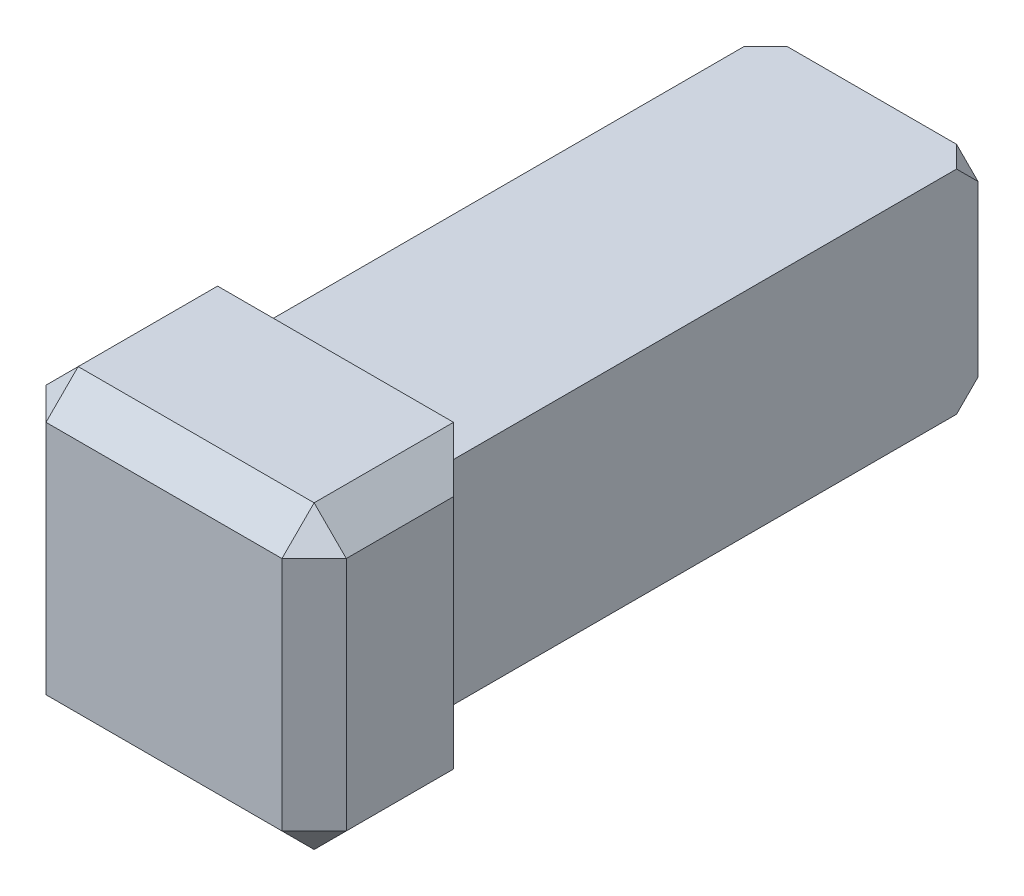
ISO-10303-21;
HEADER;
FILE_DESCRIPTION(('STEP AP214'),'2;1');
FILE_NAME('part.step','',(''),(''),'','','');
FILE_SCHEMA(('AUTOMOTIVE_DESIGN { 1 0 10303 214 1 1 1 1 }'));
ENDSEC;
DATA;
#1=APPLICATION_CONTEXT('core data for automotive mechanical design processes');
#2=APPLICATION_PROTOCOL_DEFINITION('international standard','automotive_design',2000,#1);
#3=PRODUCT_CONTEXT('',#1,'mechanical');
#4=PRODUCT('Part','Part','',(#3));
#5=PRODUCT_RELATED_PRODUCT_CATEGORY('part','',(#4));
#6=PRODUCT_DEFINITION_FORMATION('','',#4);
#7=PRODUCT_DEFINITION_CONTEXT('part definition',#1,'design');
#8=PRODUCT_DEFINITION('design','',#6,#7);
#9=PRODUCT_DEFINITION_SHAPE('','',#8);
#10=(LENGTH_UNIT() NAMED_UNIT(*) SI_UNIT(.MILLI.,.METRE.));
#11=(NAMED_UNIT(*) PLANE_ANGLE_UNIT() SI_UNIT($,.RADIAN.));
#12=(NAMED_UNIT(*) SI_UNIT($,.STERADIAN.) SOLID_ANGLE_UNIT());
#13=UNCERTAINTY_MEASURE_WITH_UNIT(LENGTH_MEASURE(1.E-05),#10,'distance_accuracy_value','');
#14=(GEOMETRIC_REPRESENTATION_CONTEXT(3) GLOBAL_UNCERTAINTY_ASSIGNED_CONTEXT((#13)) GLOBAL_UNIT_ASSIGNED_CONTEXT((#10,
#11,#12)) REPRESENTATION_CONTEXT('',''));
#15=CARTESIAN_POINT('',(0.,0.,0.));
#16=DIRECTION('',(0.,0.,1.));
#17=DIRECTION('',(1.,0.,0.));
#18=AXIS2_PLACEMENT_3D('',#15,#16,#17);
#19=CARTESIAN_POINT('',(4.95,4.95,25.));
#20=DIRECTION('',(-1.,0.,0.));
#21=DIRECTION('',(0.,-1.,0.));
#22=AXIS2_PLACEMENT_3D('',#19,#20,#21);
#23=PLANE('',#22);
#24=DIRECTION('',(0.,-0.707106781186548,0.707106781186547));
#25=VECTOR('',#24,1.);
#26=CARTESIAN_POINT('',(4.95,-12.,8.05));
#27=LINE('',#26,#25);
#28=CARTESIAN_POINT('',(4.95,-3.95,0.));
#29=VERTEX_POINT('',#28);
#30=CARTESIAN_POINT('',(4.95,-4.95,1.));
#31=VERTEX_POINT('',#30);
#32=EDGE_CURVE('E168',#29,#31,#27,.T.);
#33=ORIENTED_EDGE('',*,*,#32,.F.);
#34=DIRECTION('',(0.,1.,0.));
#35=VECTOR('',#34,1.);
#36=CARTESIAN_POINT('',(4.95,4.95,0.));
#37=LINE('',#36,#35);
#38=CARTESIAN_POINT('',(4.95,3.95,0.));
#39=VERTEX_POINT('',#38);
#40=EDGE_CURVE('E157',#29,#39,#37,.T.);
#41=ORIENTED_EDGE('',*,*,#40,.T.);
#42=DIRECTION('',(0.,-0.707106781186548,-0.707106781186547));
#43=VECTOR('',#42,1.);
#44=CARTESIAN_POINT('',(4.95,16.95,13.));
#45=LINE('',#44,#43);
#46=CARTESIAN_POINT('',(4.95,4.95,1.));
#47=VERTEX_POINT('',#46);
#48=EDGE_CURVE('E178',#47,#39,#45,.T.);
#49=ORIENTED_EDGE('',*,*,#48,.F.);
#50=DIRECTION('',(0.,0.,-1.));
#51=VECTOR('',#50,1.);
#52=CARTESIAN_POINT('',(4.95,4.95,25.));
#53=LINE('',#52,#51);
#54=CARTESIAN_POINT('',(4.95,4.95,25.));
#55=VERTEX_POINT('',#54);
#56=EDGE_CURVE('E281',#55,#47,#53,.T.);
#57=ORIENTED_EDGE('',*,*,#56,.F.);
#58=DIRECTION('',(0.,1.,0.));
#59=VECTOR('',#58,1.);
#60=CARTESIAN_POINT('',(4.95,4.95,25.));
#61=LINE('',#60,#59);
#62=CARTESIAN_POINT('',(4.95,-4.95,25.));
#63=VERTEX_POINT('',#62);
#64=EDGE_CURVE('E294',#63,#55,#61,.T.);
#65=ORIENTED_EDGE('',*,*,#64,.F.);
#66=DIRECTION('',(0.,0.,-1.));
#67=VECTOR('',#66,1.);
#68=CARTESIAN_POINT('',(4.95,-4.95,25.));
#69=LINE('',#68,#67);
#70=EDGE_CURVE('E169',#63,#31,#69,.T.);
#71=ORIENTED_EDGE('',*,*,#70,.T.);
#72=EDGE_LOOP('',(#33,#41,#49,#57,#65,#71));
#73=FACE_BOUND('',#72,.T.);
#74=ADVANCED_FACE('F35',(#73),#23,.F.);
#75=CARTESIAN_POINT('',(-4.95,4.95,25.));
#76=DIRECTION('',(0.,-1.,0.));
#77=DIRECTION('',(0.,0.,-1.));
#78=AXIS2_PLACEMENT_3D('',#75,#76,#77);
#79=PLANE('',#78);
#80=DIRECTION('',(0.707106781186548,0.,0.707106781186547));
#81=VECTOR('',#80,1.);
#82=CARTESIAN_POINT('',(12.,4.95,8.05));
#83=LINE('',#82,#81);
#84=CARTESIAN_POINT('',(3.95,4.95,0.));
#85=VERTEX_POINT('',#84);
#86=EDGE_CURVE('E175',#85,#47,#83,.T.);
#87=ORIENTED_EDGE('',*,*,#86,.F.);
#88=DIRECTION('',(-1.,0.,0.));
#89=VECTOR('',#88,1.);
#90=CARTESIAN_POINT('',(-4.95,4.95,0.));
#91=LINE('',#90,#89);
#92=CARTESIAN_POINT('',(-3.95,4.95,0.));
#93=VERTEX_POINT('',#92);
#94=EDGE_CURVE('E164',#85,#93,#91,.T.);
#95=ORIENTED_EDGE('',*,*,#94,.T.);
#96=DIRECTION('',(0.707106781186548,0.,-0.707106781186547));
#97=VECTOR('',#96,1.);
#98=CARTESIAN_POINT('',(-16.95,4.95,13.));
#99=LINE('',#98,#97);
#100=CARTESIAN_POINT('',(-4.95,4.95,0.999999999999997));
#101=VERTEX_POINT('',#100);
#102=EDGE_CURVE('E186',#101,#93,#99,.T.);
#103=ORIENTED_EDGE('',*,*,#102,.F.);
#104=DIRECTION('',(0.,0.,-1.));
#105=VECTOR('',#104,1.);
#106=CARTESIAN_POINT('',(-4.95,4.95,25.));
#107=LINE('',#106,#105);
#108=CARTESIAN_POINT('',(-4.95,4.95,25.));
#109=VERTEX_POINT('',#108);
#110=EDGE_CURVE('E284',#109,#101,#107,.T.);
#111=ORIENTED_EDGE('',*,*,#110,.F.);
#112=DIRECTION('',(-1.,0.,0.));
#113=VECTOR('',#112,1.);
#114=CARTESIAN_POINT('',(-4.95,4.95,25.));
#115=LINE('',#114,#113);
#116=EDGE_CURVE('E303',#55,#109,#115,.T.);
#117=ORIENTED_EDGE('',*,*,#116,.F.);
#118=ORIENTED_EDGE('',*,*,#56,.T.);
#119=EDGE_LOOP('',(#87,#95,#103,#111,#117,#118));
#120=FACE_BOUND('',#119,.T.);
#121=ADVANCED_FACE('F394',(#120),#79,.F.);
#122=CARTESIAN_POINT('',(-4.95,4.95,25.));
#123=DIRECTION('',(1.,0.,0.));
#124=DIRECTION('',(0.,1.,0.));
#125=AXIS2_PLACEMENT_3D('',#122,#123,#124);
#126=PLANE('',#125);
#127=DIRECTION('',(0.,0.707106781186548,0.707106781186547));
#128=VECTOR('',#127,1.);
#129=CARTESIAN_POINT('',(-4.95,16.95,13.));
#130=LINE('',#129,#128);
#131=CARTESIAN_POINT('',(-4.95,3.95,0.));
#132=VERTEX_POINT('',#131);
#133=EDGE_CURVE('E183',#132,#101,#130,.T.);
#134=ORIENTED_EDGE('',*,*,#133,.F.);
#135=DIRECTION('',(0.,-1.,0.));
#136=VECTOR('',#135,1.);
#137=CARTESIAN_POINT('',(-4.95,4.95,0.));
#138=LINE('',#137,#136);
#139=CARTESIAN_POINT('',(-4.95,-3.95,0.));
#140=VERTEX_POINT('',#139);
#141=EDGE_CURVE('E295',#132,#140,#138,.T.);
#142=ORIENTED_EDGE('',*,*,#141,.T.);
#143=DIRECTION('',(0.,0.707106781186548,-0.707106781186547));
#144=VECTOR('',#143,1.);
#145=CARTESIAN_POINT('',(-4.95,-12.,8.05));
#146=LINE('',#145,#144);
#147=CARTESIAN_POINT('',(-4.95,-4.95,0.999999999999999));
#148=VERTEX_POINT('',#147);
#149=EDGE_CURVE('E195',#148,#140,#146,.T.);
#150=ORIENTED_EDGE('',*,*,#149,.F.);
#151=DIRECTION('',(0.,0.,-1.));
#152=VECTOR('',#151,1.);
#153=CARTESIAN_POINT('',(-4.95,-4.95,25.));
#154=LINE('',#153,#152);
#155=CARTESIAN_POINT('',(-4.95,-4.95,25.));
#156=VERTEX_POINT('',#155);
#157=EDGE_CURVE('E287',#156,#148,#154,.T.);
#158=ORIENTED_EDGE('',*,*,#157,.F.);
#159=DIRECTION('',(0.,-1.,0.));
#160=VECTOR('',#159,1.);
#161=CARTESIAN_POINT('',(-4.95,4.95,25.));
#162=LINE('',#161,#160);
#163=EDGE_CURVE('E300',#109,#156,#162,.T.);
#164=ORIENTED_EDGE('',*,*,#163,.F.);
#165=ORIENTED_EDGE('',*,*,#110,.T.);
#166=EDGE_LOOP('',(#134,#142,#150,#158,#164,#165));
#167=FACE_BOUND('',#166,.T.);
#168=ADVANCED_FACE('F399',(#167),#126,.F.);
#169=CARTESIAN_POINT('',(-4.95,-4.95,25.));
#170=DIRECTION('',(0.,1.,0.));
#171=DIRECTION('',(0.,0.,1.));
#172=AXIS2_PLACEMENT_3D('',#169,#170,#171);
#173=PLANE('',#172);
#174=DIRECTION('',(-0.707106781186548,0.,-0.707106781186547));
#175=VECTOR('',#174,1.);
#176=CARTESIAN_POINT('',(12.,-4.95,8.05));
#177=LINE('',#176,#175);
#178=CARTESIAN_POINT('',(3.95,-4.95,0.));
#179=VERTEX_POINT('',#178);
#180=EDGE_CURVE('E44',#31,#179,#177,.T.);
#181=ORIENTED_EDGE('',*,*,#180,.F.);
#182=ORIENTED_EDGE('',*,*,#70,.F.);
#183=DIRECTION('',(1.,0.,0.));
#184=VECTOR('',#183,1.);
#185=CARTESIAN_POINT('',(-4.95,-4.95,25.));
#186=LINE('',#185,#184);
#187=EDGE_CURVE('E291',#156,#63,#186,.T.);
#188=ORIENTED_EDGE('',*,*,#187,.F.);
#189=ORIENTED_EDGE('',*,*,#157,.T.);
#190=DIRECTION('',(-0.707106781186548,0.,0.707106781186547));
#191=VECTOR('',#190,1.);
#192=CARTESIAN_POINT('',(-16.95,-4.95,13.));
#193=LINE('',#192,#191);
#194=CARTESIAN_POINT('',(-3.95,-4.95,0.));
#195=VERTEX_POINT('',#194);
#196=EDGE_CURVE('E192',#195,#148,#193,.T.);
#197=ORIENTED_EDGE('',*,*,#196,.F.);
#198=DIRECTION('',(1.,0.,0.));
#199=VECTOR('',#198,1.);
#200=CARTESIAN_POINT('',(-4.95,-4.95,0.));
#201=LINE('',#200,#199);
#202=EDGE_CURVE('E292',#195,#179,#201,.T.);
#203=ORIENTED_EDGE('',*,*,#202,.T.);
#204=EDGE_LOOP('',(#181,#182,#188,#189,#197,#203));
#205=FACE_BOUND('',#204,.T.);
#206=ADVANCED_FACE('F485',(#205),#173,.F.);
#207=CARTESIAN_POINT('',(0.,0.,0.));
#208=DIRECTION('',(0.,0.,1.));
#209=DIRECTION('',(1.,0.,0.));
#210=AXIS2_PLACEMENT_3D('',#207,#208,#209);
#211=PLANE('',#210);
#212=DIRECTION('',(0.707106781186548,0.707106781186548,0.));
#213=VECTOR('',#212,1.);
#214=CARTESIAN_POINT('',(4.45,-4.45,0.));
#215=LINE('',#214,#213);
#216=EDGE_CURVE('E11',#179,#29,#215,.T.);
#217=ORIENTED_EDGE('',*,*,#216,.F.);
#218=ORIENTED_EDGE('',*,*,#202,.F.);
#219=DIRECTION('',(0.707106781186548,-0.707106781186548,0.));
#220=VECTOR('',#219,1.);
#221=CARTESIAN_POINT('',(-4.45,-4.45,0.));
#222=LINE('',#221,#220);
#223=EDGE_CURVE('E189',#140,#195,#222,.T.);
#224=ORIENTED_EDGE('',*,*,#223,.F.);
#225=ORIENTED_EDGE('',*,*,#141,.F.);
#226=DIRECTION('',(-0.707106781186548,-0.707106781186548,0.));
#227=VECTOR('',#226,1.);
#228=CARTESIAN_POINT('',(-4.45,4.45,0.));
#229=LINE('',#228,#227);
#230=EDGE_CURVE('E180',#93,#132,#229,.T.);
#231=ORIENTED_EDGE('',*,*,#230,.F.);
#232=ORIENTED_EDGE('',*,*,#94,.F.);
#233=DIRECTION('',(-0.707106781186548,0.707106781186548,0.));
#234=VECTOR('',#233,1.);
#235=CARTESIAN_POINT('',(4.45,4.45,0.));
#236=LINE('',#235,#234);
#237=EDGE_CURVE('E161',#39,#85,#236,.T.);
#238=ORIENTED_EDGE('',*,*,#237,.F.);
#239=ORIENTED_EDGE('',*,*,#40,.F.);
#240=EDGE_LOOP('',(#217,#218,#224,#225,#231,#232,#238,#239));
#241=FACE_BOUND('',#240,.T.);
#242=ADVANCED_FACE('F159',(#241),#211,.F.);
#243=CARTESIAN_POINT('',(0.,0.,25.));
#244=DIRECTION('',(0.,0.,1.));
#245=DIRECTION('',(1.,0.,0.));
#246=AXIS2_PLACEMENT_3D('',#243,#244,#245);
#247=PLANE('',#246);
#248=DIRECTION('',(-1.,0.,0.));
#249=VECTOR('',#248,1.);
#250=CARTESIAN_POINT('',(-7.,7.,25.));
#251=LINE('',#250,#249);
#252=CARTESIAN_POINT('',(5.5,7.,25.));
#253=VERTEX_POINT('',#252);
#254=CARTESIAN_POINT('',(-5.5,7.,25.));
#255=VERTEX_POINT('',#254);
#256=EDGE_CURVE('E202',#253,#255,#251,.T.);
#257=ORIENTED_EDGE('',*,*,#256,.F.);
#258=DIRECTION('',(0.,-1.,0.));
#259=VECTOR('',#258,1.);
#260=CARTESIAN_POINT('',(5.5,0.,25.));
#261=LINE('',#260,#259);
#262=CARTESIAN_POINT('',(5.5,-7.,25.));
#263=VERTEX_POINT('',#262);
#264=EDGE_CURVE('E259',#253,#263,#261,.T.);
#265=ORIENTED_EDGE('',*,*,#264,.T.);
#266=DIRECTION('',(1.,0.,0.));
#267=VECTOR('',#266,1.);
#268=CARTESIAN_POINT('',(-7.,-7.,25.));
#269=LINE('',#268,#267);
#270=CARTESIAN_POINT('',(-5.5,-7.,25.));
#271=VERTEX_POINT('',#270);
#272=EDGE_CURVE('E165',#271,#263,#269,.T.);
#273=ORIENTED_EDGE('',*,*,#272,.F.);
#274=DIRECTION('',(0.707106781186547,-0.707106781186548,0.));
#275=VECTOR('',#274,1.);
#276=CARTESIAN_POINT('',(-5.5,-7.,25.));
#277=LINE('',#276,#275);
#278=CARTESIAN_POINT('',(-7.,-5.5,25.));
#279=VERTEX_POINT('',#278);
#280=EDGE_CURVE('E263',#271,#279,#277,.F.);
#281=ORIENTED_EDGE('',*,*,#280,.T.);
#282=DIRECTION('',(0.,-1.,0.));
#283=VECTOR('',#282,1.);
#284=CARTESIAN_POINT('',(-7.,7.,25.));
#285=LINE('',#284,#283);
#286=CARTESIAN_POINT('',(-7.,5.49999999999999,25.));
#287=VERTEX_POINT('',#286);
#288=EDGE_CURVE('E310',#287,#279,#285,.T.);
#289=ORIENTED_EDGE('',*,*,#288,.F.);
#290=DIRECTION('',(-0.707106781186547,-0.707106781186548,0.));
#291=VECTOR('',#290,1.);
#292=CARTESIAN_POINT('',(-7.,5.49999999999999,25.));
#293=LINE('',#292,#291);
#294=EDGE_CURVE('E261',#287,#255,#293,.F.);
#295=ORIENTED_EDGE('',*,*,#294,.T.);
#296=EDGE_LOOP('',(#257,#265,#273,#281,#289,#295));
#297=FACE_BOUND('',#296,.T.);
#298=ORIENTED_EDGE('',*,*,#187,.T.);
#299=ORIENTED_EDGE('',*,*,#64,.T.);
#300=ORIENTED_EDGE('',*,*,#116,.T.);
#301=ORIENTED_EDGE('',*,*,#163,.T.);
#302=EDGE_LOOP('',(#298,#299,#300,#301));
#303=FACE_BOUND('',#302,.T.);
#304=ADVANCED_FACE('F349',(#297,#303),#247,.F.);
#305=CARTESIAN_POINT('',(7.,7.,33.));
#306=DIRECTION('',(-1.,0.,0.));
#307=DIRECTION('',(0.,-1.,0.));
#308=AXIS2_PLACEMENT_3D('',#305,#306,#307);
#309=PLANE('',#308);
#310=DIRECTION('',(0.,-1.,0.));
#311=VECTOR('',#310,1.);
#312=CARTESIAN_POINT('',(7.,-7.,31.5));
#313=LINE('',#312,#311);
#314=CARTESIAN_POINT('',(7.,5.49999999999999,31.5));
#315=VERTEX_POINT('',#314);
#316=CARTESIAN_POINT('',(7.,-5.5,31.5));
#317=VERTEX_POINT('',#316);
#318=EDGE_CURVE('E279',#315,#317,#313,.T.);
#319=ORIENTED_EDGE('',*,*,#318,.T.);
#320=DIRECTION('',(0.,0.,-1.));
#321=VECTOR('',#320,1.);
#322=CARTESIAN_POINT('',(7.,-5.5,33.));
#323=LINE('',#322,#321);
#324=CARTESIAN_POINT('',(7.,-5.5,26.5));
#325=VERTEX_POINT('',#324);
#326=EDGE_CURVE('E272',#317,#325,#323,.T.);
#327=ORIENTED_EDGE('',*,*,#326,.T.);
#328=DIRECTION('',(0.,1.,0.));
#329=VECTOR('',#328,1.);
#330=CARTESIAN_POINT('',(7.,7.,26.5));
#331=LINE('',#330,#329);
#332=CARTESIAN_POINT('',(7.,5.49999999999999,26.5));
#333=VERTEX_POINT('',#332);
#334=EDGE_CURVE('E275',#325,#333,#331,.T.);
#335=ORIENTED_EDGE('',*,*,#334,.T.);
#336=DIRECTION('',(0.,0.,1.));
#337=VECTOR('',#336,1.);
#338=CARTESIAN_POINT('',(7.,5.49999999999999,33.));
#339=LINE('',#338,#337);
#340=EDGE_CURVE('E277',#333,#315,#339,.T.);
#341=ORIENTED_EDGE('',*,*,#340,.T.);
#342=EDGE_LOOP('',(#319,#327,#335,#341));
#343=FACE_BOUND('',#342,.T.);
#344=ADVANCED_FACE('F391',(#343),#309,.F.);
#345=CARTESIAN_POINT('',(-7.,7.,33.));
#346=DIRECTION('',(0.,-1.,0.));
#347=DIRECTION('',(0.,0.,-1.));
#348=AXIS2_PLACEMENT_3D('',#345,#346,#347);
#349=PLANE('',#348);
#350=DIRECTION('',(1.,0.,0.));
#351=VECTOR('',#350,1.);
#352=CARTESIAN_POINT('',(7.,7.,31.5));
#353=LINE('',#352,#351);
#354=CARTESIAN_POINT('',(-5.5,7.,31.5));
#355=VERTEX_POINT('',#354);
#356=CARTESIAN_POINT('',(5.5,7.,31.5));
#357=VERTEX_POINT('',#356);
#358=EDGE_CURVE('E255',#355,#357,#353,.T.);
#359=ORIENTED_EDGE('',*,*,#358,.T.);
#360=DIRECTION('',(0.,0.,-1.));
#361=VECTOR('',#360,1.);
#362=CARTESIAN_POINT('',(5.5,7.,33.));
#363=LINE('',#362,#361);
#364=EDGE_CURVE('E253',#357,#253,#363,.T.);
#365=ORIENTED_EDGE('',*,*,#364,.T.);
#366=ORIENTED_EDGE('',*,*,#256,.T.);
#367=DIRECTION('',(0.,0.,1.));
#368=VECTOR('',#367,1.);
#369=CARTESIAN_POINT('',(-5.5,7.,33.));
#370=LINE('',#369,#368);
#371=EDGE_CURVE('E257',#255,#355,#370,.T.);
#372=ORIENTED_EDGE('',*,*,#371,.T.);
#373=EDGE_LOOP('',(#359,#365,#366,#372));
#374=FACE_BOUND('',#373,.T.);
#375=ADVANCED_FACE('F317',(#374),#349,.F.);
#376=CARTESIAN_POINT('',(-7.,7.,33.));
#377=DIRECTION('',(1.,0.,0.));
#378=DIRECTION('',(0.,1.,0.));
#379=AXIS2_PLACEMENT_3D('',#376,#377,#378);
#380=PLANE('',#379);
#381=DIRECTION('',(0.,1.,0.));
#382=VECTOR('',#381,1.);
#383=CARTESIAN_POINT('',(-7.,7.,31.5));
#384=LINE('',#383,#382);
#385=CARTESIAN_POINT('',(-7.,-5.5,31.5));
#386=VERTEX_POINT('',#385);
#387=CARTESIAN_POINT('',(-7.,5.49999999999999,31.5));
#388=VERTEX_POINT('',#387);
#389=EDGE_CURVE('E240',#386,#388,#384,.T.);
#390=ORIENTED_EDGE('',*,*,#389,.T.);
#391=DIRECTION('',(0.,0.,-1.));
#392=VECTOR('',#391,1.);
#393=CARTESIAN_POINT('',(-7.,5.49999999999999,33.));
#394=LINE('',#393,#392);
#395=EDGE_CURVE('E198',#388,#287,#394,.T.);
#396=ORIENTED_EDGE('',*,*,#395,.T.);
#397=ORIENTED_EDGE('',*,*,#288,.T.);
#398=DIRECTION('',(0.,0.,1.));
#399=VECTOR('',#398,1.);
#400=CARTESIAN_POINT('',(-7.,-5.5,33.));
#401=LINE('',#400,#399);
#402=EDGE_CURVE('E242',#279,#386,#401,.T.);
#403=ORIENTED_EDGE('',*,*,#402,.T.);
#404=EDGE_LOOP('',(#390,#396,#397,#403));
#405=FACE_BOUND('',#404,.T.);
#406=ADVANCED_FACE('F381',(#405),#380,.F.);
#407=CARTESIAN_POINT('',(-7.,-7.,33.));
#408=DIRECTION('',(0.,1.,0.));
#409=DIRECTION('',(0.,0.,1.));
#410=AXIS2_PLACEMENT_3D('',#407,#408,#409);
#411=PLANE('',#410);
#412=ORIENTED_EDGE('',*,*,#272,.T.);
#413=DIRECTION('',(0.,0.,1.));
#414=VECTOR('',#413,1.);
#415=CARTESIAN_POINT('',(5.5,-7.,33.));
#416=LINE('',#415,#414);
#417=CARTESIAN_POINT('',(5.5,-7.,31.5));
#418=VERTEX_POINT('',#417);
#419=EDGE_CURVE('E265',#263,#418,#416,.T.);
#420=ORIENTED_EDGE('',*,*,#419,.T.);
#421=DIRECTION('',(-1.,0.,0.));
#422=VECTOR('',#421,1.);
#423=CARTESIAN_POINT('',(-7.,-7.,31.5));
#424=LINE('',#423,#422);
#425=CARTESIAN_POINT('',(-5.5,-7.,31.5));
#426=VERTEX_POINT('',#425);
#427=EDGE_CURVE('E268',#418,#426,#424,.T.);
#428=ORIENTED_EDGE('',*,*,#427,.T.);
#429=DIRECTION('',(0.,0.,-1.));
#430=VECTOR('',#429,1.);
#431=CARTESIAN_POINT('',(-5.5,-7.,33.));
#432=LINE('',#431,#430);
#433=EDGE_CURVE('E270',#426,#271,#432,.T.);
#434=ORIENTED_EDGE('',*,*,#433,.T.);
#435=EDGE_LOOP('',(#412,#420,#428,#434));
#436=FACE_BOUND('',#435,.T.);
#437=ADVANCED_FACE('F354',(#436),#411,.F.);
#438=CARTESIAN_POINT('',(0.,0.,33.));
#439=DIRECTION('',(0.,0.,1.));
#440=DIRECTION('',(1.,0.,0.));
#441=AXIS2_PLACEMENT_3D('',#438,#439,#440);
#442=PLANE('',#441);
#443=DIRECTION('',(0.,-1.,0.));
#444=VECTOR('',#443,1.);
#445=CARTESIAN_POINT('',(-5.5,-7.,33.));
#446=LINE('',#445,#444);
#447=CARTESIAN_POINT('',(-5.5,5.5,33.));
#448=VERTEX_POINT('',#447);
#449=CARTESIAN_POINT('',(-5.5,-5.5,33.));
#450=VERTEX_POINT('',#449);
#451=EDGE_CURVE('E251',#448,#450,#446,.T.);
#452=ORIENTED_EDGE('',*,*,#451,.T.);
#453=DIRECTION('',(1.,0.,0.));
#454=VECTOR('',#453,1.);
#455=CARTESIAN_POINT('',(7.,-5.5,33.));
#456=LINE('',#455,#454);
#457=CARTESIAN_POINT('',(5.5,-5.5,33.));
#458=VERTEX_POINT('',#457);
#459=EDGE_CURVE('E244',#450,#458,#456,.T.);
#460=ORIENTED_EDGE('',*,*,#459,.T.);
#461=DIRECTION('',(0.,1.,0.));
#462=VECTOR('',#461,1.);
#463=CARTESIAN_POINT('',(5.5,7.,33.));
#464=LINE('',#463,#462);
#465=CARTESIAN_POINT('',(5.5,5.5,33.));
#466=VERTEX_POINT('',#465);
#467=EDGE_CURVE('E247',#458,#466,#464,.T.);
#468=ORIENTED_EDGE('',*,*,#467,.T.);
#469=DIRECTION('',(-1.,0.,0.));
#470=VECTOR('',#469,1.);
#471=CARTESIAN_POINT('',(-7.,5.5,33.));
#472=LINE('',#471,#470);
#473=EDGE_CURVE('E249',#466,#448,#472,.T.);
#474=ORIENTED_EDGE('',*,*,#473,.T.);
#475=EDGE_LOOP('',(#452,#460,#468,#474));
#476=FACE_BOUND('',#475,.T.);
#477=ADVANCED_FACE('F389',(#476),#442,.T.);
#478=CARTESIAN_POINT('',(-7.,5.49999999999999,33.));
#479=DIRECTION('',(0.707106781186548,-0.707106781186547,0.));
#480=DIRECTION('',(0.,0.,-1.));
#481=AXIS2_PLACEMENT_3D('',#478,#479,#480);
#482=PLANE('',#481);
#483=DIRECTION('',(0.707106781186547,0.707106781186548,0.));
#484=VECTOR('',#483,1.);
#485=CARTESIAN_POINT('',(-6.25,6.25,31.5));
#486=LINE('',#485,#484);
#487=EDGE_CURVE('E199',#355,#388,#486,.F.);
#488=ORIENTED_EDGE('',*,*,#487,.F.);
#489=ORIENTED_EDGE('',*,*,#371,.F.);
#490=ORIENTED_EDGE('',*,*,#294,.F.);
#491=ORIENTED_EDGE('',*,*,#395,.F.);
#492=EDGE_LOOP('',(#488,#489,#490,#491));
#493=FACE_BOUND('',#492,.T.);
#494=ADVANCED_FACE('F38',(#493),#482,.F.);
#495=CARTESIAN_POINT('',(-5.5,5.5,33.));
#496=DIRECTION('',(-0.577350269189627,0.577350269189625,0.577350269189625));
#497=DIRECTION('',(0.707106781186547,0.,0.707106781186548));
#498=AXIS2_PLACEMENT_3D('',#495,#496,#497);
#499=PLANE('',#498);
#500=DIRECTION('',(0.,0.707106781186547,-0.707106781186547));
#501=VECTOR('',#500,1.);
#502=CARTESIAN_POINT('',(-5.5,5.5,33.));
#503=LINE('',#502,#501);
#504=EDGE_CURVE('E206',#355,#448,#503,.F.);
#505=ORIENTED_EDGE('',*,*,#504,.F.);
#506=ORIENTED_EDGE('',*,*,#487,.T.);
#507=DIRECTION('',(0.707106781186548,0.,0.707106781186548));
#508=VECTOR('',#507,1.);
#509=CARTESIAN_POINT('',(-5.5,5.5,33.));
#510=LINE('',#509,#508);
#511=EDGE_CURVE('E203',#448,#388,#510,.F.);
#512=ORIENTED_EDGE('',*,*,#511,.F.);
#513=EDGE_LOOP('',(#505,#506,#512));
#514=FACE_BOUND('',#513,.T.);
#515=ADVANCED_FACE('F329',(#514),#499,.T.);
#516=CARTESIAN_POINT('',(-5.5,-7.,33.));
#517=DIRECTION('',(0.707106781186548,0.707106781186547,0.));
#518=DIRECTION('',(0.,0.,-1.));
#519=AXIS2_PLACEMENT_3D('',#516,#517,#518);
#520=PLANE('',#519);
#521=ORIENTED_EDGE('',*,*,#280,.F.);
#522=ORIENTED_EDGE('',*,*,#433,.F.);
#523=DIRECTION('',(-0.707106781186547,0.707106781186548,0.));
#524=VECTOR('',#523,1.);
#525=CARTESIAN_POINT('',(-5.5,-7.,31.5));
#526=LINE('',#525,#524);
#527=EDGE_CURVE('E209',#386,#426,#526,.F.);
#528=ORIENTED_EDGE('',*,*,#527,.F.);
#529=ORIENTED_EDGE('',*,*,#402,.F.);
#530=EDGE_LOOP('',(#521,#522,#528,#529));
#531=FACE_BOUND('',#530,.T.);
#532=ADVANCED_FACE('F372',(#531),#520,.F.);
#533=CARTESIAN_POINT('',(-5.5,0.,33.));
#534=DIRECTION('',(-0.707106781186547,0.,0.707106781186547));
#535=DIRECTION('',(0.,1.,0.));
#536=AXIS2_PLACEMENT_3D('',#533,#534,#535);
#537=PLANE('',#536);
#538=ORIENTED_EDGE('',*,*,#511,.T.);
#539=ORIENTED_EDGE('',*,*,#389,.F.);
#540=DIRECTION('',(-0.707106781186547,0.,-0.707106781186547));
#541=VECTOR('',#540,1.);
#542=CARTESIAN_POINT('',(-6.25,-5.5,32.25));
#543=LINE('',#542,#541);
#544=EDGE_CURVE('E212',#450,#386,#543,.T.);
#545=ORIENTED_EDGE('',*,*,#544,.F.);
#546=ORIENTED_EDGE('',*,*,#451,.F.);
#547=EDGE_LOOP('',(#538,#539,#545,#546));
#548=FACE_BOUND('',#547,.T.);
#549=ADVANCED_FACE('F379',(#548),#537,.T.);
#550=CARTESIAN_POINT('',(0.,5.5,33.));
#551=DIRECTION('',(0.,0.707106781186547,0.707106781186547));
#552=DIRECTION('',(1.,0.,0.));
#553=AXIS2_PLACEMENT_3D('',#550,#551,#552);
#554=PLANE('',#553);
#555=ORIENTED_EDGE('',*,*,#504,.T.);
#556=ORIENTED_EDGE('',*,*,#473,.F.);
#557=DIRECTION('',(0.,-0.707106781186547,0.707106781186547));
#558=VECTOR('',#557,1.);
#559=CARTESIAN_POINT('',(5.5,6.25,32.25));
#560=LINE('',#559,#558);
#561=EDGE_CURVE('E215',#357,#466,#560,.T.);
#562=ORIENTED_EDGE('',*,*,#561,.F.);
#563=ORIENTED_EDGE('',*,*,#358,.F.);
#564=EDGE_LOOP('',(#555,#556,#562,#563));
#565=FACE_BOUND('',#564,.T.);
#566=ADVANCED_FACE('F334',(#565),#554,.T.);
#567=CARTESIAN_POINT('',(-5.5,-7.,31.5));
#568=DIRECTION('',(-0.577350269189626,-0.577350269189625,0.577350269189626));
#569=DIRECTION('',(0.707106781186548,0.,0.707106781186548));
#570=AXIS2_PLACEMENT_3D('',#567,#568,#569);
#571=PLANE('',#570);
#572=ORIENTED_EDGE('',*,*,#544,.T.);
#573=ORIENTED_EDGE('',*,*,#527,.T.);
#574=DIRECTION('',(0.,0.707106781186548,0.707106781186547));
#575=VECTOR('',#574,1.);
#576=CARTESIAN_POINT('',(-5.5,-7.,31.5));
#577=LINE('',#576,#575);
#578=EDGE_CURVE('E218',#450,#426,#577,.F.);
#579=ORIENTED_EDGE('',*,*,#578,.F.);
#580=EDGE_LOOP('',(#572,#573,#579));
#581=FACE_BOUND('',#580,.T.);
#582=ADVANCED_FACE('F375',(#581),#571,.T.);
#583=CARTESIAN_POINT('',(7.,5.49999999999999,31.5));
#584=DIRECTION('',(0.577350269189627,0.577350269189625,0.577350269189625));
#585=DIRECTION('',(0.707106781186547,0.,-0.707106781186548));
#586=AXIS2_PLACEMENT_3D('',#583,#584,#585);
#587=PLANE('',#586);
#588=DIRECTION('',(0.707106781186547,-0.707106781186548,0.));
#589=VECTOR('',#588,1.);
#590=CARTESIAN_POINT('',(7.,5.49999999999999,31.5));
#591=LINE('',#590,#589);
#592=EDGE_CURVE('E224',#357,#315,#591,.T.);
#593=ORIENTED_EDGE('',*,*,#592,.F.);
#594=ORIENTED_EDGE('',*,*,#561,.T.);
#595=DIRECTION('',(0.707106781186547,0.,-0.707106781186547));
#596=VECTOR('',#595,1.);
#597=CARTESIAN_POINT('',(7.,5.49999999999999,31.5));
#598=LINE('',#597,#596);
#599=EDGE_CURVE('E221',#315,#466,#598,.F.);
#600=ORIENTED_EDGE('',*,*,#599,.F.);
#601=EDGE_LOOP('',(#593,#594,#600));
#602=FACE_BOUND('',#601,.T.);
#603=ADVANCED_FACE('F338',(#602),#587,.T.);
#604=CARTESIAN_POINT('',(0.,-5.5,33.));
#605=DIRECTION('',(0.,-0.707106781186547,0.707106781186548));
#606=DIRECTION('',(-1.,0.,0.));
#607=AXIS2_PLACEMENT_3D('',#604,#605,#606);
#608=PLANE('',#607);
#609=ORIENTED_EDGE('',*,*,#578,.T.);
#610=ORIENTED_EDGE('',*,*,#427,.F.);
#611=DIRECTION('',(0.,-0.707106781186548,-0.707106781186547));
#612=VECTOR('',#611,1.);
#613=CARTESIAN_POINT('',(5.5,-7.,31.5));
#614=LINE('',#613,#612);
#615=EDGE_CURVE('E227',#458,#418,#614,.T.);
#616=ORIENTED_EDGE('',*,*,#615,.F.);
#617=ORIENTED_EDGE('',*,*,#459,.F.);
#618=EDGE_LOOP('',(#609,#610,#616,#617));
#619=FACE_BOUND('',#618,.T.);
#620=ADVANCED_FACE('F368',(#619),#608,.T.);
#621=CARTESIAN_POINT('',(5.5,0.,33.));
#622=DIRECTION('',(0.707106781186547,0.,0.707106781186547));
#623=DIRECTION('',(0.,-1.,0.));
#624=AXIS2_PLACEMENT_3D('',#621,#622,#623);
#625=PLANE('',#624);
#626=ORIENTED_EDGE('',*,*,#599,.T.);
#627=ORIENTED_EDGE('',*,*,#467,.F.);
#628=DIRECTION('',(-0.707106781186548,0.,0.707106781186548));
#629=VECTOR('',#628,1.);
#630=CARTESIAN_POINT('',(6.25,-5.5,32.25));
#631=LINE('',#630,#629);
#632=EDGE_CURVE('E230',#317,#458,#631,.T.);
#633=ORIENTED_EDGE('',*,*,#632,.F.);
#634=ORIENTED_EDGE('',*,*,#318,.F.);
#635=EDGE_LOOP('',(#626,#627,#633,#634));
#636=FACE_BOUND('',#635,.T.);
#637=ADVANCED_FACE('F426',(#636),#625,.T.);
#638=CARTESIAN_POINT('',(5.5,7.,33.));
#639=DIRECTION('',(-0.707106781186548,-0.707106781186547,0.));
#640=DIRECTION('',(0.,0.,-1.));
#641=AXIS2_PLACEMENT_3D('',#638,#639,#640);
#642=PLANE('',#641);
#643=ORIENTED_EDGE('',*,*,#592,.T.);
#644=ORIENTED_EDGE('',*,*,#340,.F.);
#645=DIRECTION('',(-0.577350269189626,0.577350269189627,-0.577350269189624));
#646=VECTOR('',#645,1.);
#647=CARTESIAN_POINT('',(8.16666666666666,4.33333333333333,27.6666666666667));
#648=LINE('',#647,#646);
#649=EDGE_CURVE('E232',#253,#333,#648,.F.);
#650=ORIENTED_EDGE('',*,*,#649,.F.);
#651=ORIENTED_EDGE('',*,*,#364,.F.);
#652=EDGE_LOOP('',(#643,#644,#650,#651));
#653=FACE_BOUND('',#652,.T.);
#654=ADVANCED_FACE('F342',(#653),#642,.F.);
#655=CARTESIAN_POINT('',(5.5,-7.,31.5));
#656=DIRECTION('',(0.577350269189626,-0.577350269189625,0.577350269189626));
#657=DIRECTION('',(0.707106781186548,0.,-0.707106781186548));
#658=AXIS2_PLACEMENT_3D('',#655,#656,#657);
#659=PLANE('',#658);
#660=ORIENTED_EDGE('',*,*,#632,.T.);
#661=ORIENTED_EDGE('',*,*,#615,.T.);
#662=DIRECTION('',(-0.707106781186547,-0.707106781186548,0.));
#663=VECTOR('',#662,1.);
#664=CARTESIAN_POINT('',(5.5,-7.,31.5));
#665=LINE('',#664,#663);
#666=EDGE_CURVE('E235',#317,#418,#665,.T.);
#667=ORIENTED_EDGE('',*,*,#666,.F.);
#668=EDGE_LOOP('',(#660,#661,#667));
#669=FACE_BOUND('',#668,.T.);
#670=ADVANCED_FACE('F363',(#669),#659,.T.);
#671=CARTESIAN_POINT('',(7.,7.,26.5));
#672=DIRECTION('',(-0.707106781186547,0.,0.707106781186548));
#673=DIRECTION('',(0.,1.,0.));
#674=AXIS2_PLACEMENT_3D('',#671,#672,#673);
#675=PLANE('',#674);
#676=ORIENTED_EDGE('',*,*,#649,.T.);
#677=ORIENTED_EDGE('',*,*,#334,.F.);
#678=DIRECTION('',(-0.577350269189626,-0.577350269189627,-0.577350269189624));
#679=VECTOR('',#678,1.);
#680=CARTESIAN_POINT('',(11.1666666666667,-1.33333333333331,30.6666666666667));
#681=LINE('',#680,#679);
#682=EDGE_CURVE('E237',#263,#325,#681,.F.);
#683=ORIENTED_EDGE('',*,*,#682,.F.);
#684=ORIENTED_EDGE('',*,*,#264,.F.);
#685=EDGE_LOOP('',(#676,#677,#683,#684));
#686=FACE_BOUND('',#685,.T.);
#687=ADVANCED_FACE('F347',(#686),#675,.F.);
#688=CARTESIAN_POINT('',(7.,-5.5,33.));
#689=DIRECTION('',(-0.707106781186548,0.707106781186547,0.));
#690=DIRECTION('',(0.,0.,-1.));
#691=AXIS2_PLACEMENT_3D('',#688,#689,#690);
#692=PLANE('',#691);
#693=ORIENTED_EDGE('',*,*,#666,.T.);
#694=ORIENTED_EDGE('',*,*,#419,.F.);
#695=ORIENTED_EDGE('',*,*,#682,.T.);
#696=ORIENTED_EDGE('',*,*,#326,.F.);
#697=EDGE_LOOP('',(#693,#694,#695,#696));
#698=FACE_BOUND('',#697,.T.);
#699=ADVANCED_FACE('F357',(#698),#692,.F.);
#700=CARTESIAN_POINT('',(-2.96666666666667,-2.96666666666667,-2.96666666666667));
#701=DIRECTION('',(-0.577350269189626,-0.577350269189626,-0.577350269189626));
#702=DIRECTION('',(-0.707106781186548,0.,0.707106781186547));
#703=AXIS2_PLACEMENT_3D('',#700,#701,#702);
#704=PLANE('',#703);
#705=ORIENTED_EDGE('',*,*,#196,.T.);
#706=ORIENTED_EDGE('',*,*,#149,.T.);
#707=ORIENTED_EDGE('',*,*,#223,.T.);
#708=EDGE_LOOP('',(#705,#706,#707));
#709=FACE_BOUND('',#708,.T.);
#710=ADVANCED_FACE('F410',(#709),#704,.T.);
#711=CARTESIAN_POINT('',(-2.96666666666667,2.96666666666667,-2.96666666666667));
#712=DIRECTION('',(-0.577350269189626,0.577350269189626,-0.577350269189626));
#713=DIRECTION('',(-0.707106781186548,0.,0.707106781186547));
#714=AXIS2_PLACEMENT_3D('',#711,#712,#713);
#715=PLANE('',#714);
#716=ORIENTED_EDGE('',*,*,#133,.T.);
#717=ORIENTED_EDGE('',*,*,#102,.T.);
#718=ORIENTED_EDGE('',*,*,#230,.T.);
#719=EDGE_LOOP('',(#716,#717,#718));
#720=FACE_BOUND('',#719,.T.);
#721=ADVANCED_FACE('F500',(#720),#715,.T.);
#722=CARTESIAN_POINT('',(2.96666666666667,2.96666666666667,-2.96666666666667));
#723=DIRECTION('',(0.577350269189626,0.577350269189626,-0.577350269189626));
#724=DIRECTION('',(-0.707106781186548,0.,-0.707106781186547));
#725=AXIS2_PLACEMENT_3D('',#722,#723,#724);
#726=PLANE('',#725);
#727=ORIENTED_EDGE('',*,*,#86,.T.);
#728=ORIENTED_EDGE('',*,*,#48,.T.);
#729=ORIENTED_EDGE('',*,*,#237,.T.);
#730=EDGE_LOOP('',(#727,#728,#729));
#731=FACE_BOUND('',#730,.T.);
#732=ADVANCED_FACE('F507',(#731),#726,.T.);
#733=CARTESIAN_POINT('',(2.96666666666667,-2.96666666666667,-2.96666666666667));
#734=DIRECTION('',(0.577350269189626,-0.577350269189626,-0.577350269189626));
#735=DIRECTION('',(-0.707106781186548,0.,-0.707106781186547));
#736=AXIS2_PLACEMENT_3D('',#733,#734,#735);
#737=PLANE('',#736);
#738=ORIENTED_EDGE('',*,*,#216,.T.);
#739=ORIENTED_EDGE('',*,*,#32,.T.);
#740=ORIENTED_EDGE('',*,*,#180,.T.);
#741=EDGE_LOOP('',(#738,#739,#740));
#742=FACE_BOUND('',#741,.T.);
#743=ADVANCED_FACE('F172',(#742),#737,.T.);
#744=CLOSED_SHELL('',(#74,#121,#168,#206,#242,#304,#344,#375,#406,#437,#477,#494,#515,#532,#549,
#566,#582,#603,#620,#637,#654,#670,#687,#699,#710,#721,#732,#743));
#745=MANIFOLD_SOLID_BREP('B2',#744);
#746=ADVANCED_BREP_SHAPE_REPRESENTATION('',(#18,#745),#14);
#747=SHAPE_DEFINITION_REPRESENTATION(#9,#746);
ENDSEC;
END-ISO-10303-21;
